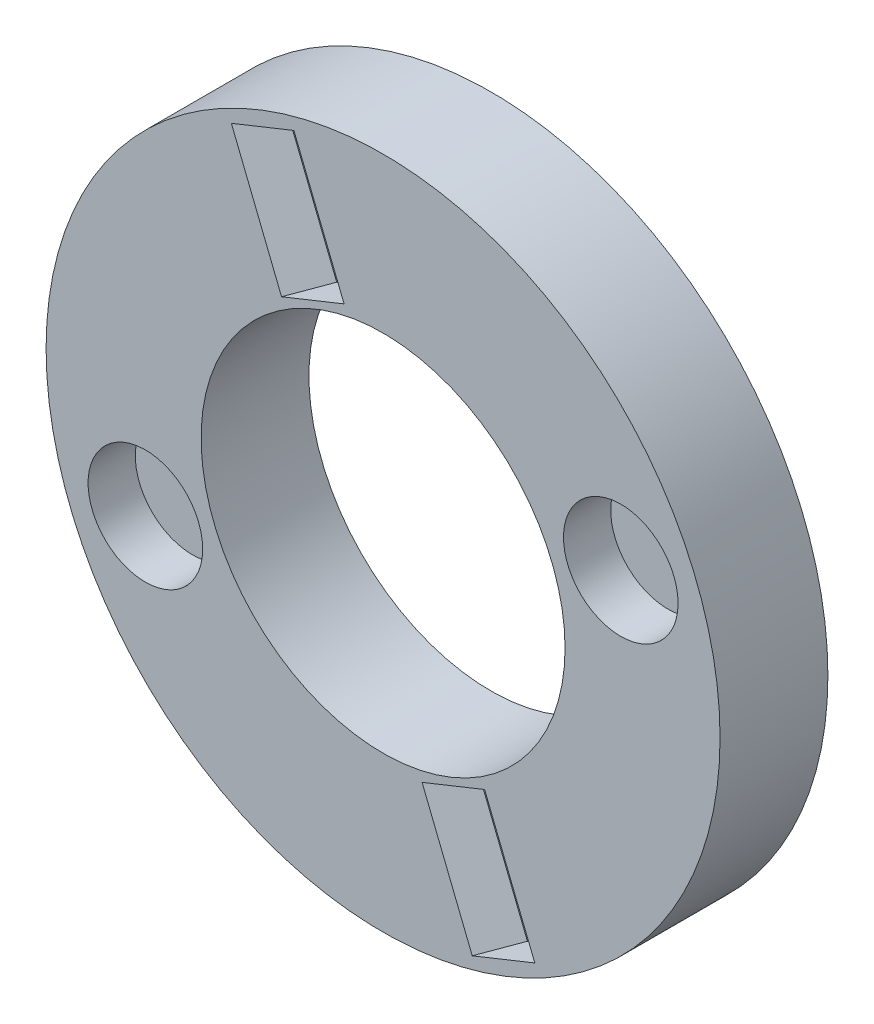
ISO-10303-21;
HEADER;
FILE_DESCRIPTION(('STEP AP214'),'2;1');
FILE_NAME('part.step','',(''),(''),'','','');
FILE_SCHEMA(('AUTOMOTIVE_DESIGN { 1 0 10303 214 1 1 1 1 }'));
ENDSEC;
DATA;
#1=APPLICATION_CONTEXT('core data for automotive mechanical design processes');
#2=APPLICATION_PROTOCOL_DEFINITION('international standard','automotive_design',2000,#1);
#3=PRODUCT_CONTEXT('',#1,'mechanical');
#4=PRODUCT('Part','Part','',(#3));
#5=PRODUCT_RELATED_PRODUCT_CATEGORY('part','',(#4));
#6=PRODUCT_DEFINITION_FORMATION('','',#4);
#7=PRODUCT_DEFINITION_CONTEXT('part definition',#1,'design');
#8=PRODUCT_DEFINITION('design','',#6,#7);
#9=PRODUCT_DEFINITION_SHAPE('','',#8);
#10=(LENGTH_UNIT() NAMED_UNIT(*) SI_UNIT(.MILLI.,.METRE.));
#11=(NAMED_UNIT(*) PLANE_ANGLE_UNIT() SI_UNIT($,.RADIAN.));
#12=(NAMED_UNIT(*) SI_UNIT($,.STERADIAN.) SOLID_ANGLE_UNIT());
#13=UNCERTAINTY_MEASURE_WITH_UNIT(LENGTH_MEASURE(1.E-05),#10,'distance_accuracy_value','');
#14=(GEOMETRIC_REPRESENTATION_CONTEXT(3) GLOBAL_UNCERTAINTY_ASSIGNED_CONTEXT((#13)) GLOBAL_UNIT_ASSIGNED_CONTEXT((#10,
#11,#12)) REPRESENTATION_CONTEXT('',''));
#15=CARTESIAN_POINT('',(0.,0.,0.));
#16=DIRECTION('',(0.,0.,1.));
#17=DIRECTION('',(1.,0.,0.));
#18=AXIS2_PLACEMENT_3D('',#15,#16,#17);
#19=CARTESIAN_POINT('',(0.,0.,0.));
#20=DIRECTION('',(0.,0.,1.));
#21=DIRECTION('',(1.,0.,0.));
#22=AXIS2_PLACEMENT_3D('',#19,#20,#21);
#23=PLANE('',#22);
#24=DIRECTION('',(0.372326681962271,-0.928101741135618,0.));
#25=VECTOR('',#24,1.);
#26=CARTESIAN_POINT('',(23.2052584921605,6.61558601425546,0.));
#27=LINE('',#26,#25);
#28=CARTESIAN_POINT('',(21.3436250823492,11.2560947199335,0.));
#29=VERTEX_POINT('',#28);
#30=CARTESIAN_POINT('',(23.2052584921605,6.61558601425546,0.));
#31=VERTEX_POINT('',#30);
#32=EDGE_CURVE('E201',#29,#31,#27,.T.);
#33=ORIENTED_EDGE('',*,*,#32,.F.);
#34=DIRECTION('',(-0.928101741135618,-0.372326681962271,0.));
#35=VECTOR('',#34,1.);
#36=CARTESIAN_POINT('',(21.3436250823492,11.2560947199335,0.));
#37=LINE('',#36,#35);
#38=CARTESIAN_POINT('',(12.062607670993,7.53282790031084,0.));
#39=VERTEX_POINT('',#38);
#40=EDGE_CURVE('E216',#29,#39,#37,.T.);
#41=ORIENTED_EDGE('',*,*,#40,.T.);
#42=DIRECTION('',(0.372326681962271,-0.928101741135618,0.));
#43=VECTOR('',#42,1.);
#44=CARTESIAN_POINT('',(13.9242410808043,2.89231919463275,0.));
#45=LINE('',#44,#43);
#46=CARTESIAN_POINT('',(13.9242410808043,2.89231919463275,0.));
#47=VERTEX_POINT('',#46);
#48=EDGE_CURVE('E195',#39,#47,#45,.T.);
#49=ORIENTED_EDGE('',*,*,#48,.T.);
#50=DIRECTION('',(-0.928101741135618,-0.372326681962271,0.));
#51=VECTOR('',#50,1.);
#52=CARTESIAN_POINT('',(23.2052584921605,6.61558601425546,0.));
#53=LINE('',#52,#51);
#54=EDGE_CURVE('E213',#31,#47,#53,.T.);
#55=ORIENTED_EDGE('',*,*,#54,.F.);
#56=EDGE_LOOP('',(#33,#41,#49,#55));
#57=FACE_BOUND('',#56,.T.);
#58=CARTESIAN_POINT('',(0.,0.,0.));
#59=DIRECTION('',(0.,0.,1.));
#60=DIRECTION('',(1.,0.,0.));
#61=AXIS2_PLACEMENT_3D('',#58,#59,#60);
#62=CIRCLE('',#61,13.5);
#63=CARTESIAN_POINT('',(13.5,0.,0.));
#64=VERTEX_POINT('',#63);
#65=EDGE_CURVE('E39',#64,#64,#62,.T.);
#66=ORIENTED_EDGE('',*,*,#65,.T.);
#67=EDGE_LOOP('',(#66));
#68=FACE_BOUND('',#67,.T.);
#69=CARTESIAN_POINT('',(7.07420695728315,-17.6339330815767,0.));
#70=DIRECTION('',(0.,0.,-1.));
#71=DIRECTION('',(-1.,0.,0.));
#72=AXIS2_PLACEMENT_3D('',#69,#70,#71);
#73=CIRCLE('',#72,4.25);
#74=CARTESIAN_POINT('',(2.82420695728315,-17.6339330815767,0.));
#75=VERTEX_POINT('',#74);
#76=EDGE_CURVE('E234',#75,#75,#73,.T.);
#77=ORIENTED_EDGE('',*,*,#76,.F.);
#78=EDGE_LOOP('',(#77));
#79=FACE_BOUND('',#78,.T.);
#80=CARTESIAN_POINT('',(-7.07420695728315,17.6339330815767,0.));
#81=DIRECTION('',(0.,0.,-1.));
#82=DIRECTION('',(-1.,0.,0.));
#83=AXIS2_PLACEMENT_3D('',#80,#81,#82);
#84=CIRCLE('',#83,4.25);
#85=CARTESIAN_POINT('',(-11.3242069572831,17.6339330815767,0.));
#86=VERTEX_POINT('',#85);
#87=EDGE_CURVE('E240',#86,#86,#84,.T.);
#88=ORIENTED_EDGE('',*,*,#87,.F.);
#89=EDGE_LOOP('',(#88));
#90=FACE_BOUND('',#89,.T.);
#91=CARTESIAN_POINT('',(0.,0.,0.));
#92=DIRECTION('',(0.,0.,1.));
#93=DIRECTION('',(1.,0.,0.));
#94=AXIS2_PLACEMENT_3D('',#91,#92,#93);
#95=CIRCLE('',#94,25.);
#96=CARTESIAN_POINT('',(25.,0.,0.));
#97=VERTEX_POINT('',#96);
#98=EDGE_CURVE('E44',#97,#97,#95,.T.);
#99=ORIENTED_EDGE('',*,*,#98,.F.);
#100=EDGE_LOOP('',(#99));
#101=FACE_BOUND('',#100,.T.);
#102=DIRECTION('',(0.372326681962271,-0.928101741135618,0.));
#103=VECTOR('',#102,1.);
#104=CARTESIAN_POINT('',(-21.3436250823492,-11.2560947199335,0.));
#105=LINE('',#104,#103);
#106=CARTESIAN_POINT('',(-23.2052584921605,-6.61558601425545,0.));
#107=VERTEX_POINT('',#106);
#108=CARTESIAN_POINT('',(-21.3436250823492,-11.2560947199335,0.));
#109=VERTEX_POINT('',#108);
#110=EDGE_CURVE('E171',#107,#109,#105,.T.);
#111=ORIENTED_EDGE('',*,*,#110,.T.);
#112=DIRECTION('',(0.928101741135618,0.372326681962271,0.));
#113=VECTOR('',#112,1.);
#114=CARTESIAN_POINT('',(-21.3436250823492,-11.2560947199335,0.));
#115=LINE('',#114,#113);
#116=CARTESIAN_POINT('',(-12.062607670993,-7.53282790031083,0.));
#117=VERTEX_POINT('',#116);
#118=EDGE_CURVE('E154',#109,#117,#115,.T.);
#119=ORIENTED_EDGE('',*,*,#118,.T.);
#120=DIRECTION('',(0.372326681962271,-0.928101741135618,0.));
#121=VECTOR('',#120,1.);
#122=CARTESIAN_POINT('',(-12.062607670993,-7.53282790031083,0.));
#123=LINE('',#122,#121);
#124=CARTESIAN_POINT('',(-13.9242410808043,-2.89231919463274,0.));
#125=VERTEX_POINT('',#124);
#126=EDGE_CURVE('E180',#125,#117,#123,.T.);
#127=ORIENTED_EDGE('',*,*,#126,.F.);
#128=DIRECTION('',(0.928101741135618,0.372326681962271,0.));
#129=VECTOR('',#128,1.);
#130=CARTESIAN_POINT('',(-23.2052584921605,-6.61558601425545,0.));
#131=LINE('',#130,#129);
#132=EDGE_CURVE('E52',#107,#125,#131,.T.);
#133=ORIENTED_EDGE('',*,*,#132,.F.);
#134=EDGE_LOOP('',(#111,#119,#127,#133));
#135=FACE_BOUND('',#134,.T.);
#136=ADVANCED_FACE('F35',(#57,#68,#79,#90,#101,#135),#23,.F.);
#137=CARTESIAN_POINT('',(0.,0.,8.));
#138=DIRECTION('',(0.,0.,1.));
#139=DIRECTION('',(1.,0.,0.));
#140=AXIS2_PLACEMENT_3D('',#137,#138,#139);
#141=PLANE('',#140);
#142=CARTESIAN_POINT('',(0.,0.,8.));
#143=DIRECTION('',(0.,0.,1.));
#144=DIRECTION('',(1.,0.,0.));
#145=AXIS2_PLACEMENT_3D('',#142,#143,#144);
#146=CIRCLE('',#145,13.5);
#147=CARTESIAN_POINT('',(13.5,0.,8.));
#148=VERTEX_POINT('',#147);
#149=EDGE_CURVE('E215',#148,#148,#146,.T.);
#150=ORIENTED_EDGE('',*,*,#149,.F.);
#151=EDGE_LOOP('',(#150));
#152=FACE_BOUND('',#151,.T.);
#153=CARTESIAN_POINT('',(-17.6339330815767,-7.07420695728315,8.));
#154=DIRECTION('',(0.,0.,1.));
#155=DIRECTION('',(1.,0.,0.));
#156=AXIS2_PLACEMENT_3D('',#153,#154,#155);
#157=CIRCLE('',#156,4.25);
#158=CARTESIAN_POINT('',(-13.3839330815767,-7.07420695728315,8.));
#159=VERTEX_POINT('',#158);
#160=EDGE_CURVE('E228',#159,#159,#157,.T.);
#161=ORIENTED_EDGE('',*,*,#160,.F.);
#162=EDGE_LOOP('',(#161));
#163=FACE_BOUND('',#162,.T.);
#164=CARTESIAN_POINT('',(17.6339330815767,7.07420695728315,8.));
#165=DIRECTION('',(0.,0.,1.));
#166=DIRECTION('',(1.,0.,0.));
#167=AXIS2_PLACEMENT_3D('',#164,#165,#166);
#168=CIRCLE('',#167,4.25);
#169=CARTESIAN_POINT('',(21.8839330815767,7.07420695728315,8.));
#170=VERTEX_POINT('',#169);
#171=EDGE_CURVE('E227',#170,#170,#168,.T.);
#172=ORIENTED_EDGE('',*,*,#171,.F.);
#173=EDGE_LOOP('',(#172));
#174=FACE_BOUND('',#173,.T.);
#175=CARTESIAN_POINT('',(0.,0.,8.));
#176=DIRECTION('',(0.,0.,1.));
#177=DIRECTION('',(1.,0.,0.));
#178=AXIS2_PLACEMENT_3D('',#175,#176,#177);
#179=CIRCLE('',#178,25.);
#180=CARTESIAN_POINT('',(25.,0.,8.));
#181=VERTEX_POINT('',#180);
#182=EDGE_CURVE('E11',#181,#181,#179,.T.);
#183=ORIENTED_EDGE('',*,*,#182,.T.);
#184=EDGE_LOOP('',(#183));
#185=FACE_BOUND('',#184,.T.);
#186=DIRECTION('',(-0.372326681962271,0.928101741135618,0.));
#187=VECTOR('',#186,1.);
#188=CARTESIAN_POINT('',(11.2560947199335,-21.3436250823492,8.));
#189=LINE('',#188,#187);
#190=CARTESIAN_POINT('',(11.2560947199335,-21.3436250823492,8.));
#191=VERTEX_POINT('',#190);
#192=CARTESIAN_POINT('',(7.53282790031083,-12.062607670993,8.));
#193=VERTEX_POINT('',#192);
#194=EDGE_CURVE('E303',#191,#193,#189,.T.);
#195=ORIENTED_EDGE('',*,*,#194,.F.);
#196=DIRECTION('',(0.928101741135618,0.372326681962271,0.));
#197=VECTOR('',#196,1.);
#198=CARTESIAN_POINT('',(11.2560947199335,-21.3436250823492,8.));
#199=LINE('',#198,#197);
#200=CARTESIAN_POINT('',(6.61558601425545,-23.2052584921605,8.));
#201=VERTEX_POINT('',#200);
#202=EDGE_CURVE('E290',#201,#191,#199,.T.);
#203=ORIENTED_EDGE('',*,*,#202,.F.);
#204=DIRECTION('',(-0.372326681962271,0.928101741135618,0.));
#205=VECTOR('',#204,1.);
#206=CARTESIAN_POINT('',(6.61558601425545,-23.2052584921605,8.));
#207=LINE('',#206,#205);
#208=CARTESIAN_POINT('',(2.89231919463274,-13.9242410808043,8.));
#209=VERTEX_POINT('',#208);
#210=EDGE_CURVE('E306',#201,#209,#207,.T.);
#211=ORIENTED_EDGE('',*,*,#210,.T.);
#212=DIRECTION('',(0.928101741135618,0.372326681962271,0.));
#213=VECTOR('',#212,1.);
#214=CARTESIAN_POINT('',(7.53282790031084,-12.062607670993,8.));
#215=LINE('',#214,#213);
#216=EDGE_CURVE('E284',#209,#193,#215,.T.);
#217=ORIENTED_EDGE('',*,*,#216,.T.);
#218=EDGE_LOOP('',(#195,#203,#211,#217));
#219=FACE_BOUND('',#218,.T.);
#220=DIRECTION('',(0.372326681962271,-0.928101741135618,0.));
#221=VECTOR('',#220,1.);
#222=CARTESIAN_POINT('',(-11.2560947199335,21.3436250823492,8.));
#223=LINE('',#222,#221);
#224=CARTESIAN_POINT('',(-11.2560947199335,21.3436250823492,8.));
#225=VERTEX_POINT('',#224);
#226=CARTESIAN_POINT('',(-7.53282790031083,12.062607670993,8.));
#227=VERTEX_POINT('',#226);
#228=EDGE_CURVE('E276',#225,#227,#223,.T.);
#229=ORIENTED_EDGE('',*,*,#228,.F.);
#230=DIRECTION('',(0.928101741135618,0.372326681962271,0.));
#231=VECTOR('',#230,1.);
#232=CARTESIAN_POINT('',(-6.61558601425545,23.2052584921605,8.));
#233=LINE('',#232,#231);
#234=CARTESIAN_POINT('',(-6.61558601425545,23.2052584921605,8.));
#235=VERTEX_POINT('',#234);
#236=EDGE_CURVE('E252',#225,#235,#233,.T.);
#237=ORIENTED_EDGE('',*,*,#236,.T.);
#238=DIRECTION('',(0.372326681962271,-0.928101741135618,0.));
#239=VECTOR('',#238,1.);
#240=CARTESIAN_POINT('',(-6.61558601425545,23.2052584921605,8.));
#241=LINE('',#240,#239);
#242=CARTESIAN_POINT('',(-2.89231919463274,13.9242410808043,8.));
#243=VERTEX_POINT('',#242);
#244=EDGE_CURVE('E260',#235,#243,#241,.T.);
#245=ORIENTED_EDGE('',*,*,#244,.T.);
#246=DIRECTION('',(0.928101741135618,0.372326681962271,0.));
#247=VECTOR('',#246,1.);
#248=CARTESIAN_POINT('',(-2.89231919463274,13.9242410808043,8.));
#249=LINE('',#248,#247);
#250=EDGE_CURVE('E263',#227,#243,#249,.T.);
#251=ORIENTED_EDGE('',*,*,#250,.F.);
#252=EDGE_LOOP('',(#229,#237,#245,#251));
#253=FACE_BOUND('',#252,.T.);
#254=ADVANCED_FACE('F316',(#152,#163,#174,#185,#219,#253),#141,.T.);
#255=CARTESIAN_POINT('',(0.,0.,8.));
#256=DIRECTION('',(0.,0.,-1.));
#257=DIRECTION('',(-1.,0.,0.));
#258=AXIS2_PLACEMENT_3D('',#255,#256,#257);
#259=CYLINDRICAL_SURFACE('',#258,25.);
#260=ORIENTED_EDGE('',*,*,#182,.F.);
#261=EDGE_LOOP('',(#260));
#262=FACE_BOUND('',#261,.T.);
#263=ORIENTED_EDGE('',*,*,#98,.T.);
#264=EDGE_LOOP('',(#263));
#265=FACE_BOUND('',#264,.T.);
#266=ADVANCED_FACE('F37',(#262,#265),#259,.T.);
#267=CARTESIAN_POINT('',(9.39989123766231,-22.0882784462737,5.76393202250021));
#268=DIRECTION('',(0.691766194405051,0.277515923568194,-0.666666666666667));
#269=DIRECTION('',(-0.693923251960422,0.,-0.720048970826758));
#270=AXIS2_PLACEMENT_3D('',#267,#268,#269);
#271=PLANE('',#270);
#272=DIRECTION('',(-0.618734494090412,-0.248217787974847,-0.745355992499929));
#273=VECTOR('',#272,1.);
#274=CARTESIAN_POINT('',(5.6766244180396,-12.8072610349175,5.76393202250021));
#275=LINE('',#274,#273);
#276=CARTESIAN_POINT('',(5.6766244180396,-12.8072610349175,5.76393202250021));
#277=VERTEX_POINT('',#276);
#278=EDGE_CURVE('E272',#193,#277,#275,.T.);
#279=ORIENTED_EDGE('',*,*,#278,.T.);
#280=DIRECTION('',(-0.372326681962271,0.928101741135618,0.));
#281=VECTOR('',#280,1.);
#282=CARTESIAN_POINT('',(9.39989123766231,-22.0882784462737,5.76393202250021));
#283=LINE('',#282,#281);
#284=CARTESIAN_POINT('',(9.39989123766231,-22.0882784462737,5.76393202250021));
#285=VERTEX_POINT('',#284);
#286=EDGE_CURVE('E293',#285,#277,#283,.T.);
#287=ORIENTED_EDGE('',*,*,#286,.F.);
#288=DIRECTION('',(-0.618734494090412,-0.248217787974847,-0.745355992499929));
#289=VECTOR('',#288,1.);
#290=CARTESIAN_POINT('',(9.39989123766231,-22.0882784462737,5.76393202250021));
#291=LINE('',#290,#289);
#292=EDGE_CURVE('E280',#191,#285,#291,.T.);
#293=ORIENTED_EDGE('',*,*,#292,.F.);
#294=ORIENTED_EDGE('',*,*,#194,.T.);
#295=EDGE_LOOP('',(#279,#287,#293,#294));
#296=FACE_BOUND('',#295,.T.);
#297=ADVANCED_FACE('F326',(#296),#271,.F.);
#298=CARTESIAN_POINT('',(6.61558601425545,-23.2052584921605,8.));
#299=DIRECTION('',(-0.691766194405052,-0.277515923568194,-0.666666666666667));
#300=DIRECTION('',(-0.693923251960421,0.,0.720048970826758));
#301=AXIS2_PLACEMENT_3D('',#298,#299,#300);
#302=PLANE('',#301);
#303=DIRECTION('',(-0.618734494090412,-0.248217787974847,0.74535599249993));
#304=VECTOR('',#303,1.);
#305=CARTESIAN_POINT('',(2.89231919463274,-13.9242410808043,8.));
#306=LINE('',#305,#304);
#307=CARTESIAN_POINT('',(4.74852267690398,-13.1795877168798,5.76393202250021));
#308=VERTEX_POINT('',#307);
#309=EDGE_CURVE('E299',#308,#209,#306,.T.);
#310=ORIENTED_EDGE('',*,*,#309,.T.);
#311=ORIENTED_EDGE('',*,*,#210,.F.);
#312=DIRECTION('',(-0.618734494090412,-0.248217787974847,0.74535599249993));
#313=VECTOR('',#312,1.);
#314=CARTESIAN_POINT('',(6.61558601425545,-23.2052584921605,8.));
#315=LINE('',#314,#313);
#316=CARTESIAN_POINT('',(8.47178949652669,-22.460605128236,5.76393202250021));
#317=VERTEX_POINT('',#316);
#318=EDGE_CURVE('E287',#317,#201,#315,.T.);
#319=ORIENTED_EDGE('',*,*,#318,.F.);
#320=DIRECTION('',(-0.372326681962271,0.928101741135618,0.));
#321=VECTOR('',#320,1.);
#322=CARTESIAN_POINT('',(8.47178949652669,-22.460605128236,5.76393202250021));
#323=LINE('',#322,#321);
#324=EDGE_CURVE('E309',#317,#308,#323,.T.);
#325=ORIENTED_EDGE('',*,*,#324,.T.);
#326=EDGE_LOOP('',(#310,#311,#319,#325));
#327=FACE_BOUND('',#326,.T.);
#328=ADVANCED_FACE('F329',(#327),#302,.F.);
#329=CARTESIAN_POINT('',(8.47178949652669,-22.460605128236,5.76393202250021));
#330=DIRECTION('',(0.,0.,-1.));
#331=DIRECTION('',(-1.,0.,0.));
#332=AXIS2_PLACEMENT_3D('',#329,#330,#331);
#333=PLANE('',#332);
#334=DIRECTION('',(-0.928101741135618,-0.372326681962271,0.));
#335=VECTOR('',#334,1.);
#336=CARTESIAN_POINT('',(4.74852267690398,-13.1795877168798,5.76393202250021));
#337=LINE('',#336,#335);
#338=EDGE_CURVE('E296',#277,#308,#337,.T.);
#339=ORIENTED_EDGE('',*,*,#338,.T.);
#340=ORIENTED_EDGE('',*,*,#324,.F.);
#341=DIRECTION('',(-0.928101741135618,-0.372326681962271,0.));
#342=VECTOR('',#341,1.);
#343=CARTESIAN_POINT('',(8.47178949652669,-22.460605128236,5.76393202250021));
#344=LINE('',#343,#342);
#345=EDGE_CURVE('E283',#285,#317,#344,.T.);
#346=ORIENTED_EDGE('',*,*,#345,.F.);
#347=ORIENTED_EDGE('',*,*,#286,.T.);
#348=EDGE_LOOP('',(#339,#340,#346,#347));
#349=FACE_BOUND('',#348,.T.);
#350=ADVANCED_FACE('F331',(#349),#333,.F.);
#351=CARTESIAN_POINT('',(8.9358403670945,-22.2744417872548,0.));
#352=DIRECTION('',(-0.372326681962271,0.928101741135618,0.));
#353=DIRECTION('',(-0.928101741135618,-0.372326681962271,0.));
#354=AXIS2_PLACEMENT_3D('',#351,#352,#353);
#355=PLANE('',#354);
#356=ORIENTED_EDGE('',*,*,#292,.T.);
#357=ORIENTED_EDGE('',*,*,#345,.T.);
#358=ORIENTED_EDGE('',*,*,#318,.T.);
#359=ORIENTED_EDGE('',*,*,#202,.T.);
#360=EDGE_LOOP('',(#356,#357,#358,#359));
#361=FACE_BOUND('',#360,.T.);
#362=ADVANCED_FACE('F334',(#361),#355,.T.);
#363=CARTESIAN_POINT('',(5.21257354747179,-12.9934243758987,0.));
#364=DIRECTION('',(-0.372326681962271,0.928101741135618,0.));
#365=DIRECTION('',(-0.928101741135618,-0.372326681962271,0.));
#366=AXIS2_PLACEMENT_3D('',#363,#364,#365);
#367=PLANE('',#366);
#368=ORIENTED_EDGE('',*,*,#278,.F.);
#369=ORIENTED_EDGE('',*,*,#216,.F.);
#370=ORIENTED_EDGE('',*,*,#309,.F.);
#371=ORIENTED_EDGE('',*,*,#338,.F.);
#372=EDGE_LOOP('',(#368,#369,#370,#371));
#373=FACE_BOUND('',#372,.T.);
#374=ADVANCED_FACE('F339',(#373),#367,.F.);
#375=CARTESIAN_POINT('',(-8.47178949652668,22.460605128236,5.76393202250021));
#376=DIRECTION('',(-0.691766194405051,-0.277515923568194,0.666666666666667));
#377=DIRECTION('',(0.693923251960422,0.,0.720048970826758));
#378=AXIS2_PLACEMENT_3D('',#375,#376,#377);
#379=PLANE('',#378);
#380=DIRECTION('',(-0.618734494090412,-0.248217787974847,-0.745355992499929));
#381=VECTOR('',#380,1.);
#382=CARTESIAN_POINT('',(-4.74852267690398,13.1795877168798,5.76393202250021));
#383=LINE('',#382,#381);
#384=CARTESIAN_POINT('',(-4.74852267690398,13.1795877168798,5.76393202250021));
#385=VERTEX_POINT('',#384);
#386=EDGE_CURVE('E246',#243,#385,#383,.T.);
#387=ORIENTED_EDGE('',*,*,#386,.F.);
#388=ORIENTED_EDGE('',*,*,#244,.F.);
#389=DIRECTION('',(-0.618734494090412,-0.248217787974847,-0.745355992499929));
#390=VECTOR('',#389,1.);
#391=CARTESIAN_POINT('',(-8.47178949652668,22.460605128236,5.76393202250021));
#392=LINE('',#391,#390);
#393=CARTESIAN_POINT('',(-8.47178949652668,22.460605128236,5.76393202250021));
#394=VERTEX_POINT('',#393);
#395=EDGE_CURVE('E249',#235,#394,#392,.T.);
#396=ORIENTED_EDGE('',*,*,#395,.T.);
#397=DIRECTION('',(0.372326681962271,-0.928101741135618,0.));
#398=VECTOR('',#397,1.);
#399=CARTESIAN_POINT('',(-8.47178949652668,22.460605128236,5.76393202250021));
#400=LINE('',#399,#398);
#401=EDGE_CURVE('E269',#394,#385,#400,.T.);
#402=ORIENTED_EDGE('',*,*,#401,.T.);
#403=EDGE_LOOP('',(#387,#388,#396,#402));
#404=FACE_BOUND('',#403,.T.);
#405=ADVANCED_FACE('F342',(#404),#379,.T.);
#406=CARTESIAN_POINT('',(-9.3998912376623,22.0882784462737,5.76393202250021));
#407=DIRECTION('',(0.,0.,1.));
#408=DIRECTION('',(1.,0.,0.));
#409=AXIS2_PLACEMENT_3D('',#406,#407,#408);
#410=PLANE('',#409);
#411=DIRECTION('',(-0.928101741135618,-0.372326681962271,0.));
#412=VECTOR('',#411,1.);
#413=CARTESIAN_POINT('',(-5.6766244180396,12.8072610349175,5.76393202250021));
#414=LINE('',#413,#412);
#415=CARTESIAN_POINT('',(-5.6766244180396,12.8072610349175,5.76393202250021));
#416=VERTEX_POINT('',#415);
#417=EDGE_CURVE('E253',#385,#416,#414,.T.);
#418=ORIENTED_EDGE('',*,*,#417,.F.);
#419=ORIENTED_EDGE('',*,*,#401,.F.);
#420=DIRECTION('',(-0.928101741135618,-0.372326681962271,0.));
#421=VECTOR('',#420,1.);
#422=CARTESIAN_POINT('',(-9.3998912376623,22.0882784462737,5.76393202250021));
#423=LINE('',#422,#421);
#424=CARTESIAN_POINT('',(-9.3998912376623,22.0882784462737,5.76393202250021));
#425=VERTEX_POINT('',#424);
#426=EDGE_CURVE('E258',#394,#425,#423,.T.);
#427=ORIENTED_EDGE('',*,*,#426,.T.);
#428=DIRECTION('',(0.372326681962271,-0.928101741135618,0.));
#429=VECTOR('',#428,1.);
#430=CARTESIAN_POINT('',(-9.3998912376623,22.0882784462737,5.76393202250021));
#431=LINE('',#430,#429);
#432=EDGE_CURVE('E273',#425,#416,#431,.T.);
#433=ORIENTED_EDGE('',*,*,#432,.T.);
#434=EDGE_LOOP('',(#418,#419,#427,#433));
#435=FACE_BOUND('',#434,.T.);
#436=ADVANCED_FACE('F349',(#435),#410,.T.);
#437=CARTESIAN_POINT('',(-11.2560947199335,21.3436250823492,8.));
#438=DIRECTION('',(0.691766194405052,0.277515923568194,0.666666666666667));
#439=DIRECTION('',(0.693923251960421,0.,-0.720048970826758));
#440=AXIS2_PLACEMENT_3D('',#437,#438,#439);
#441=PLANE('',#440);
#442=DIRECTION('',(-0.618734494090412,-0.248217787974847,0.74535599249993));
#443=VECTOR('',#442,1.);
#444=CARTESIAN_POINT('',(-7.53282790031083,12.062607670993,8.));
#445=LINE('',#444,#443);
#446=EDGE_CURVE('E265',#416,#227,#445,.T.);
#447=ORIENTED_EDGE('',*,*,#446,.F.);
#448=ORIENTED_EDGE('',*,*,#432,.F.);
#449=DIRECTION('',(-0.618734494090412,-0.248217787974847,0.74535599249993));
#450=VECTOR('',#449,1.);
#451=CARTESIAN_POINT('',(-11.2560947199335,21.3436250823492,8.));
#452=LINE('',#451,#450);
#453=EDGE_CURVE('E256',#425,#225,#452,.T.);
#454=ORIENTED_EDGE('',*,*,#453,.T.);
#455=ORIENTED_EDGE('',*,*,#228,.T.);
#456=EDGE_LOOP('',(#447,#448,#454,#455));
#457=FACE_BOUND('',#456,.T.);
#458=ADVANCED_FACE('F351',(#457),#441,.T.);
#459=CARTESIAN_POINT('',(-8.93584036709449,22.2744417872548,0.));
#460=DIRECTION('',(0.372326681962271,-0.928101741135618,0.));
#461=DIRECTION('',(-0.928101741135618,-0.372326681962271,0.));
#462=AXIS2_PLACEMENT_3D('',#459,#460,#461);
#463=PLANE('',#462);
#464=ORIENTED_EDGE('',*,*,#395,.F.);
#465=ORIENTED_EDGE('',*,*,#236,.F.);
#466=ORIENTED_EDGE('',*,*,#453,.F.);
#467=ORIENTED_EDGE('',*,*,#426,.F.);
#468=EDGE_LOOP('',(#464,#465,#466,#467));
#469=FACE_BOUND('',#468,.T.);
#470=ADVANCED_FACE('F354',(#469),#463,.T.);
#471=CARTESIAN_POINT('',(-5.21257354747179,12.9934243758987,0.));
#472=DIRECTION('',(0.372326681962271,-0.928101741135618,0.));
#473=DIRECTION('',(-0.928101741135618,-0.372326681962271,0.));
#474=AXIS2_PLACEMENT_3D('',#471,#472,#473);
#475=PLANE('',#474);
#476=ORIENTED_EDGE('',*,*,#386,.T.);
#477=ORIENTED_EDGE('',*,*,#417,.T.);
#478=ORIENTED_EDGE('',*,*,#446,.T.);
#479=ORIENTED_EDGE('',*,*,#250,.T.);
#480=EDGE_LOOP('',(#476,#477,#478,#479));
#481=FACE_BOUND('',#480,.T.);
#482=ADVANCED_FACE('F359',(#481),#475,.F.);
#483=CARTESIAN_POINT('',(-7.07420695728315,17.6339330815767,3.5));
#484=DIRECTION('',(0.,0.,-1.));
#485=DIRECTION('',(-1.,0.,0.));
#486=AXIS2_PLACEMENT_3D('',#483,#484,#485);
#487=CYLINDRICAL_SURFACE('',#486,4.25);
#488=CARTESIAN_POINT('',(-7.07420695728315,17.6339330815767,3.5));
#489=DIRECTION('',(0.,0.,-1.));
#490=DIRECTION('',(-1.,0.,0.));
#491=AXIS2_PLACEMENT_3D('',#488,#489,#490);
#492=CIRCLE('',#491,4.25);
#493=CARTESIAN_POINT('',(-11.3242069572831,17.6339330815767,3.5));
#494=VERTEX_POINT('',#493);
#495=EDGE_CURVE('E243',#494,#494,#492,.T.);
#496=ORIENTED_EDGE('',*,*,#495,.F.);
#497=EDGE_LOOP('',(#496));
#498=FACE_BOUND('',#497,.T.);
#499=ORIENTED_EDGE('',*,*,#87,.T.);
#500=EDGE_LOOP('',(#499));
#501=FACE_BOUND('',#500,.T.);
#502=ADVANCED_FACE('F362',(#498,#501),#487,.F.);
#503=CARTESIAN_POINT('',(-7.07420695728315,17.6339330815767,3.5));
#504=DIRECTION('',(0.,0.,-1.));
#505=DIRECTION('',(-1.,0.,0.));
#506=AXIS2_PLACEMENT_3D('',#503,#504,#505);
#507=PLANE('',#506);
#508=ORIENTED_EDGE('',*,*,#495,.T.);
#509=EDGE_LOOP('',(#508));
#510=FACE_BOUND('',#509,.T.);
#511=ADVANCED_FACE('F369',(#510),#507,.T.);
#512=CARTESIAN_POINT('',(7.07420695728315,-17.6339330815767,3.5));
#513=DIRECTION('',(0.,0.,-1.));
#514=DIRECTION('',(-1.,0.,0.));
#515=AXIS2_PLACEMENT_3D('',#512,#513,#514);
#516=CYLINDRICAL_SURFACE('',#515,4.25);
#517=CARTESIAN_POINT('',(7.07420695728315,-17.6339330815767,3.5));
#518=DIRECTION('',(0.,0.,-1.));
#519=DIRECTION('',(-1.,0.,0.));
#520=AXIS2_PLACEMENT_3D('',#517,#518,#519);
#521=CIRCLE('',#520,4.25);
#522=CARTESIAN_POINT('',(2.82420695728315,-17.6339330815767,3.5));
#523=VERTEX_POINT('',#522);
#524=EDGE_CURVE('E237',#523,#523,#521,.T.);
#525=ORIENTED_EDGE('',*,*,#524,.F.);
#526=EDGE_LOOP('',(#525));
#527=FACE_BOUND('',#526,.T.);
#528=ORIENTED_EDGE('',*,*,#76,.T.);
#529=EDGE_LOOP('',(#528));
#530=FACE_BOUND('',#529,.T.);
#531=ADVANCED_FACE('F373',(#527,#530),#516,.F.);
#532=CARTESIAN_POINT('',(7.07420695728315,-17.6339330815767,3.5));
#533=DIRECTION('',(0.,0.,-1.));
#534=DIRECTION('',(-1.,0.,0.));
#535=AXIS2_PLACEMENT_3D('',#532,#533,#534);
#536=PLANE('',#535);
#537=ORIENTED_EDGE('',*,*,#524,.T.);
#538=EDGE_LOOP('',(#537));
#539=FACE_BOUND('',#538,.T.);
#540=ADVANCED_FACE('F377',(#539),#536,.T.);
#541=CARTESIAN_POINT('',(17.6339330815767,7.07420695728315,4.5));
#542=DIRECTION('',(0.,0.,1.));
#543=DIRECTION('',(1.,0.,0.));
#544=AXIS2_PLACEMENT_3D('',#541,#542,#543);
#545=CYLINDRICAL_SURFACE('',#544,4.25);
#546=CARTESIAN_POINT('',(17.6339330815767,7.07420695728315,4.5));
#547=DIRECTION('',(0.,0.,1.));
#548=DIRECTION('',(1.,0.,0.));
#549=AXIS2_PLACEMENT_3D('',#546,#547,#548);
#550=CIRCLE('',#549,4.25);
#551=CARTESIAN_POINT('',(21.8839330815767,7.07420695728315,4.5));
#552=VERTEX_POINT('',#551);
#553=EDGE_CURVE('E231',#552,#552,#550,.T.);
#554=ORIENTED_EDGE('',*,*,#553,.F.);
#555=EDGE_LOOP('',(#554));
#556=FACE_BOUND('',#555,.T.);
#557=ORIENTED_EDGE('',*,*,#171,.T.);
#558=EDGE_LOOP('',(#557));
#559=FACE_BOUND('',#558,.T.);
#560=ADVANCED_FACE('F381',(#556,#559),#545,.F.);
#561=CARTESIAN_POINT('',(17.6339330815767,7.07420695728315,4.5));
#562=DIRECTION('',(0.,0.,1.));
#563=DIRECTION('',(1.,0.,0.));
#564=AXIS2_PLACEMENT_3D('',#561,#562,#563);
#565=PLANE('',#564);
#566=ORIENTED_EDGE('',*,*,#553,.T.);
#567=EDGE_LOOP('',(#566));
#568=FACE_BOUND('',#567,.T.);
#569=ADVANCED_FACE('F385',(#568),#565,.T.);
#570=CARTESIAN_POINT('',(-17.6339330815767,-7.07420695728315,4.5));
#571=DIRECTION('',(0.,0.,1.));
#572=DIRECTION('',(1.,0.,0.));
#573=AXIS2_PLACEMENT_3D('',#570,#571,#572);
#574=CYLINDRICAL_SURFACE('',#573,4.25);
#575=CARTESIAN_POINT('',(-17.6339330815767,-7.07420695728315,4.5));
#576=DIRECTION('',(0.,0.,1.));
#577=DIRECTION('',(1.,0.,0.));
#578=AXIS2_PLACEMENT_3D('',#575,#576,#577);
#579=CIRCLE('',#578,4.25);
#580=CARTESIAN_POINT('',(-13.3839330815767,-7.07420695728315,4.5));
#581=VERTEX_POINT('',#580);
#582=EDGE_CURVE('E224',#581,#581,#579,.T.);
#583=ORIENTED_EDGE('',*,*,#582,.F.);
#584=EDGE_LOOP('',(#583));
#585=FACE_BOUND('',#584,.T.);
#586=ORIENTED_EDGE('',*,*,#160,.T.);
#587=EDGE_LOOP('',(#586));
#588=FACE_BOUND('',#587,.T.);
#589=ADVANCED_FACE('F389',(#585,#588),#574,.F.);
#590=CARTESIAN_POINT('',(-17.6339330815767,-7.07420695728315,4.5));
#591=DIRECTION('',(0.,0.,1.));
#592=DIRECTION('',(1.,0.,0.));
#593=AXIS2_PLACEMENT_3D('',#590,#591,#592);
#594=PLANE('',#593);
#595=ORIENTED_EDGE('',*,*,#582,.T.);
#596=EDGE_LOOP('',(#595));
#597=FACE_BOUND('',#596,.T.);
#598=ADVANCED_FACE('F393',(#597),#594,.T.);
#599=CARTESIAN_POINT('',(0.,0.,-2.));
#600=DIRECTION('',(0.,0.,1.));
#601=DIRECTION('',(1.,0.,0.));
#602=AXIS2_PLACEMENT_3D('',#599,#600,#601);
#603=CYLINDRICAL_SURFACE('',#602,13.5);
#604=ORIENTED_EDGE('',*,*,#149,.T.);
#605=EDGE_LOOP('',(#604));
#606=FACE_BOUND('',#605,.T.);
#607=ORIENTED_EDGE('',*,*,#65,.F.);
#608=EDGE_LOOP('',(#607));
#609=FACE_BOUND('',#608,.T.);
#610=ADVANCED_FACE('F397',(#606,#609),#603,.F.);
#611=CARTESIAN_POINT('',(22.460605128236,8.47178949652669,2.23606797749979));
#612=DIRECTION('',(0.277515923568194,-0.691766194405052,0.666666666666667));
#613=DIRECTION('',(0.,-0.693923251960421,-0.720048970826758));
#614=AXIS2_PLACEMENT_3D('',#611,#612,#613);
#615=PLANE('',#614);
#616=DIRECTION('',(-0.248217787974847,0.618734494090412,0.74535599249993));
#617=VECTOR('',#616,1.);
#618=CARTESIAN_POINT('',(13.1795877168798,4.74852267690398,2.23606797749979));
#619=LINE('',#618,#617);
#620=CARTESIAN_POINT('',(13.1795877168798,4.74852267690398,2.23606797749979));
#621=VERTEX_POINT('',#620);
#622=EDGE_CURVE('E60',#47,#621,#619,.T.);
#623=ORIENTED_EDGE('',*,*,#622,.T.);
#624=DIRECTION('',(-0.928101741135618,-0.372326681962271,0.));
#625=VECTOR('',#624,1.);
#626=CARTESIAN_POINT('',(22.460605128236,8.47178949652669,2.23606797749979));
#627=LINE('',#626,#625);
#628=CARTESIAN_POINT('',(22.460605128236,8.47178949652669,2.23606797749979));
#629=VERTEX_POINT('',#628);
#630=EDGE_CURVE('E204',#629,#621,#627,.T.);
#631=ORIENTED_EDGE('',*,*,#630,.F.);
#632=DIRECTION('',(-0.248217787974847,0.618734494090412,0.74535599249993));
#633=VECTOR('',#632,1.);
#634=CARTESIAN_POINT('',(22.460605128236,8.47178949652669,2.23606797749979));
#635=LINE('',#634,#633);
#636=EDGE_CURVE('E191',#31,#629,#635,.T.);
#637=ORIENTED_EDGE('',*,*,#636,.F.);
#638=ORIENTED_EDGE('',*,*,#54,.T.);
#639=EDGE_LOOP('',(#623,#631,#637,#638));
#640=FACE_BOUND('',#639,.T.);
#641=ADVANCED_FACE('F401',(#640),#615,.F.);
#642=CARTESIAN_POINT('',(21.3436250823492,11.2560947199335,0.));
#643=DIRECTION('',(-0.277515923568194,0.691766194405052,0.666666666666667));
#644=DIRECTION('',(0.,-0.693923251960421,0.720048970826758));
#645=AXIS2_PLACEMENT_3D('',#642,#643,#644);
#646=PLANE('',#645);
#647=DIRECTION('',(-0.248217787974847,0.618734494090412,-0.74535599249993));
#648=VECTOR('',#647,1.);
#649=CARTESIAN_POINT('',(12.062607670993,7.53282790031084,0.));
#650=LINE('',#649,#648);
#651=CARTESIAN_POINT('',(12.8072610349175,5.6766244180396,2.23606797749979));
#652=VERTEX_POINT('',#651);
#653=EDGE_CURVE('E209',#652,#39,#650,.T.);
#654=ORIENTED_EDGE('',*,*,#653,.T.);
#655=ORIENTED_EDGE('',*,*,#40,.F.);
#656=DIRECTION('',(-0.248217787974847,0.618734494090412,-0.74535599249993));
#657=VECTOR('',#656,1.);
#658=CARTESIAN_POINT('',(21.3436250823492,11.2560947199335,0.));
#659=LINE('',#658,#657);
#660=CARTESIAN_POINT('',(22.0882784462737,9.39989123766231,2.23606797749979));
#661=VERTEX_POINT('',#660);
#662=EDGE_CURVE('E198',#661,#29,#659,.T.);
#663=ORIENTED_EDGE('',*,*,#662,.F.);
#664=DIRECTION('',(-0.928101741135618,-0.372326681962271,0.));
#665=VECTOR('',#664,1.);
#666=CARTESIAN_POINT('',(22.0882784462737,9.39989123766231,2.23606797749979));
#667=LINE('',#666,#665);
#668=EDGE_CURVE('E219',#661,#652,#667,.T.);
#669=ORIENTED_EDGE('',*,*,#668,.T.);
#670=EDGE_LOOP('',(#654,#655,#663,#669));
#671=FACE_BOUND('',#670,.T.);
#672=ADVANCED_FACE('F405',(#671),#646,.F.);
#673=CARTESIAN_POINT('',(22.0882784462737,9.39989123766231,2.23606797749979));
#674=DIRECTION('',(0.,0.,1.));
#675=DIRECTION('',(1.,0.,0.));
#676=AXIS2_PLACEMENT_3D('',#673,#674,#675);
#677=PLANE('',#676);
#678=DIRECTION('',(-0.372326681962271,0.928101741135618,0.));
#679=VECTOR('',#678,1.);
#680=CARTESIAN_POINT('',(12.8072610349175,5.6766244180396,2.23606797749979));
#681=LINE('',#680,#679);
#682=EDGE_CURVE('E206',#621,#652,#681,.T.);
#683=ORIENTED_EDGE('',*,*,#682,.T.);
#684=ORIENTED_EDGE('',*,*,#668,.F.);
#685=DIRECTION('',(-0.372326681962271,0.928101741135618,0.));
#686=VECTOR('',#685,1.);
#687=CARTESIAN_POINT('',(22.0882784462737,9.39989123766231,2.23606797749979));
#688=LINE('',#687,#686);
#689=EDGE_CURVE('E194',#629,#661,#688,.T.);
#690=ORIENTED_EDGE('',*,*,#689,.F.);
#691=ORIENTED_EDGE('',*,*,#630,.T.);
#692=EDGE_LOOP('',(#683,#684,#690,#691));
#693=FACE_BOUND('',#692,.T.);
#694=ADVANCED_FACE('F407',(#693),#677,.F.);
#695=CARTESIAN_POINT('',(22.2744417872548,8.9358403670945,0.));
#696=DIRECTION('',(-0.928101741135618,-0.372326681962271,0.));
#697=DIRECTION('',(0.372326681962271,-0.928101741135618,0.));
#698=AXIS2_PLACEMENT_3D('',#695,#696,#697);
#699=PLANE('',#698);
#700=ORIENTED_EDGE('',*,*,#636,.T.);
#701=ORIENTED_EDGE('',*,*,#689,.T.);
#702=ORIENTED_EDGE('',*,*,#662,.T.);
#703=ORIENTED_EDGE('',*,*,#32,.T.);
#704=EDGE_LOOP('',(#700,#701,#702,#703));
#705=FACE_BOUND('',#704,.T.);
#706=ADVANCED_FACE('F410',(#705),#699,.T.);
#707=CARTESIAN_POINT('',(12.9934243758987,5.21257354747179,0.));
#708=DIRECTION('',(-0.928101741135618,-0.372326681962271,0.));
#709=DIRECTION('',(0.372326681962271,-0.928101741135618,0.));
#710=AXIS2_PLACEMENT_3D('',#707,#708,#709);
#711=PLANE('',#710);
#712=ORIENTED_EDGE('',*,*,#622,.F.);
#713=ORIENTED_EDGE('',*,*,#48,.F.);
#714=ORIENTED_EDGE('',*,*,#653,.F.);
#715=ORIENTED_EDGE('',*,*,#682,.F.);
#716=EDGE_LOOP('',(#712,#713,#714,#715));
#717=FACE_BOUND('',#716,.T.);
#718=ADVANCED_FACE('F415',(#717),#711,.F.);
#719=CARTESIAN_POINT('',(-22.0882784462737,-9.3998912376623,2.23606797749979));
#720=DIRECTION('',(-0.277515923568194,0.691766194405052,-0.666666666666667));
#721=DIRECTION('',(0.,0.693923251960421,0.720048970826758));
#722=AXIS2_PLACEMENT_3D('',#719,#720,#721);
#723=PLANE('',#722);
#724=DIRECTION('',(-0.248217787974847,0.618734494090412,0.74535599249993));
#725=VECTOR('',#724,1.);
#726=CARTESIAN_POINT('',(-12.8072610349175,-5.6766244180396,2.23606797749979));
#727=LINE('',#726,#725);
#728=CARTESIAN_POINT('',(-12.8072610349175,-5.6766244180396,2.23606797749979));
#729=VERTEX_POINT('',#728);
#730=EDGE_CURVE('E161',#117,#729,#727,.T.);
#731=ORIENTED_EDGE('',*,*,#730,.F.);
#732=ORIENTED_EDGE('',*,*,#118,.F.);
#733=DIRECTION('',(-0.248217787974847,0.618734494090412,0.74535599249993));
#734=VECTOR('',#733,1.);
#735=CARTESIAN_POINT('',(-22.0882784462737,-9.3998912376623,2.23606797749979));
#736=LINE('',#735,#734);
#737=CARTESIAN_POINT('',(-22.0882784462737,-9.3998912376623,2.23606797749979));
#738=VERTEX_POINT('',#737);
#739=EDGE_CURVE('E158',#109,#738,#736,.T.);
#740=ORIENTED_EDGE('',*,*,#739,.T.);
#741=DIRECTION('',(0.928101741135618,0.372326681962271,0.));
#742=VECTOR('',#741,1.);
#743=CARTESIAN_POINT('',(-22.0882784462737,-9.3998912376623,2.23606797749979));
#744=LINE('',#743,#742);
#745=EDGE_CURVE('E185',#738,#729,#744,.T.);
#746=ORIENTED_EDGE('',*,*,#745,.T.);
#747=EDGE_LOOP('',(#731,#732,#740,#746));
#748=FACE_BOUND('',#747,.T.);
#749=ADVANCED_FACE('F156',(#748),#723,.T.);
#750=CARTESIAN_POINT('',(-22.460605128236,-8.47178949652668,2.23606797749979));
#751=DIRECTION('',(0.,0.,-1.));
#752=DIRECTION('',(-1.,0.,0.));
#753=AXIS2_PLACEMENT_3D('',#750,#751,#752);
#754=PLANE('',#753);
#755=DIRECTION('',(-0.372326681962271,0.928101741135618,0.));
#756=VECTOR('',#755,1.);
#757=CARTESIAN_POINT('',(-13.1795877168798,-4.74852267690398,2.23606797749979));
#758=LINE('',#757,#756);
#759=CARTESIAN_POINT('',(-13.1795877168798,-4.74852267690398,2.23606797749979));
#760=VERTEX_POINT('',#759);
#761=EDGE_CURVE('E172',#729,#760,#758,.T.);
#762=ORIENTED_EDGE('',*,*,#761,.F.);
#763=ORIENTED_EDGE('',*,*,#745,.F.);
#764=DIRECTION('',(-0.372326681962271,0.928101741135618,0.));
#765=VECTOR('',#764,1.);
#766=CARTESIAN_POINT('',(-22.460605128236,-8.47178949652668,2.23606797749979));
#767=LINE('',#766,#765);
#768=CARTESIAN_POINT('',(-22.460605128236,-8.47178949652668,2.23606797749979));
#769=VERTEX_POINT('',#768);
#770=EDGE_CURVE('E165',#738,#769,#767,.T.);
#771=ORIENTED_EDGE('',*,*,#770,.T.);
#772=DIRECTION('',(0.928101741135618,0.372326681962271,0.));
#773=VECTOR('',#772,1.);
#774=CARTESIAN_POINT('',(-22.460605128236,-8.47178949652668,2.23606797749979));
#775=LINE('',#774,#773);
#776=EDGE_CURVE('E187',#769,#760,#775,.T.);
#777=ORIENTED_EDGE('',*,*,#776,.T.);
#778=EDGE_LOOP('',(#762,#763,#771,#777));
#779=FACE_BOUND('',#778,.T.);
#780=ADVANCED_FACE('F423',(#779),#754,.T.);
#781=CARTESIAN_POINT('',(-23.2052584921605,-6.61558601425545,0.));
#782=DIRECTION('',(0.277515923568194,-0.691766194405052,-0.666666666666667));
#783=DIRECTION('',(0.,0.693923251960421,-0.720048970826758));
#784=AXIS2_PLACEMENT_3D('',#781,#782,#783);
#785=PLANE('',#784);
#786=DIRECTION('',(-0.248217787974847,0.618734494090412,-0.74535599249993));
#787=VECTOR('',#786,1.);
#788=CARTESIAN_POINT('',(-13.9242410808043,-2.89231919463274,0.));
#789=LINE('',#788,#787);
#790=EDGE_CURVE('E182',#760,#125,#789,.T.);
#791=ORIENTED_EDGE('',*,*,#790,.F.);
#792=ORIENTED_EDGE('',*,*,#776,.F.);
#793=DIRECTION('',(-0.248217787974847,0.618734494090412,-0.74535599249993));
#794=VECTOR('',#793,1.);
#795=CARTESIAN_POINT('',(-23.2052584921605,-6.61558601425545,0.));
#796=LINE('',#795,#794);
#797=EDGE_CURVE('E174',#769,#107,#796,.T.);
#798=ORIENTED_EDGE('',*,*,#797,.T.);
#799=ORIENTED_EDGE('',*,*,#132,.T.);
#800=EDGE_LOOP('',(#791,#792,#798,#799));
#801=FACE_BOUND('',#800,.T.);
#802=ADVANCED_FACE('F424',(#801),#785,.T.);
#803=CARTESIAN_POINT('',(-22.2744417872548,-8.93584036709449,0.));
#804=DIRECTION('',(0.928101741135618,0.372326681962271,0.));
#805=DIRECTION('',(0.372326681962271,-0.928101741135618,0.));
#806=AXIS2_PLACEMENT_3D('',#803,#804,#805);
#807=PLANE('',#806);
#808=ORIENTED_EDGE('',*,*,#739,.F.);
#809=ORIENTED_EDGE('',*,*,#110,.F.);
#810=ORIENTED_EDGE('',*,*,#797,.F.);
#811=ORIENTED_EDGE('',*,*,#770,.F.);
#812=EDGE_LOOP('',(#808,#809,#810,#811));
#813=FACE_BOUND('',#812,.T.);
#814=ADVANCED_FACE('F169',(#813),#807,.T.);
#815=CARTESIAN_POINT('',(-12.9934243758987,-5.21257354747179,0.));
#816=DIRECTION('',(0.928101741135618,0.372326681962271,0.));
#817=DIRECTION('',(0.372326681962271,-0.928101741135618,0.));
#818=AXIS2_PLACEMENT_3D('',#815,#816,#817);
#819=PLANE('',#818);
#820=ORIENTED_EDGE('',*,*,#730,.T.);
#821=ORIENTED_EDGE('',*,*,#761,.T.);
#822=ORIENTED_EDGE('',*,*,#790,.T.);
#823=ORIENTED_EDGE('',*,*,#126,.T.);
#824=EDGE_LOOP('',(#820,#821,#822,#823));
#825=FACE_BOUND('',#824,.T.);
#826=ADVANCED_FACE('F430',(#825),#819,.F.);
#827=CLOSED_SHELL('',(#136,#254,#266,#297,#328,#350,#362,#374,#405,#436,#458,#470,#482,#502,
#511,#531,#540,#560,#569,#589,#598,#610,#641,#672,#694,#706,#718,#749,#780,#802,#814,#826));
#828=MANIFOLD_SOLID_BREP('B2',#827);
#829=ADVANCED_BREP_SHAPE_REPRESENTATION('',(#18,#828),#14);
#830=SHAPE_DEFINITION_REPRESENTATION(#9,#829);
ENDSEC;
END-ISO-10303-21;
